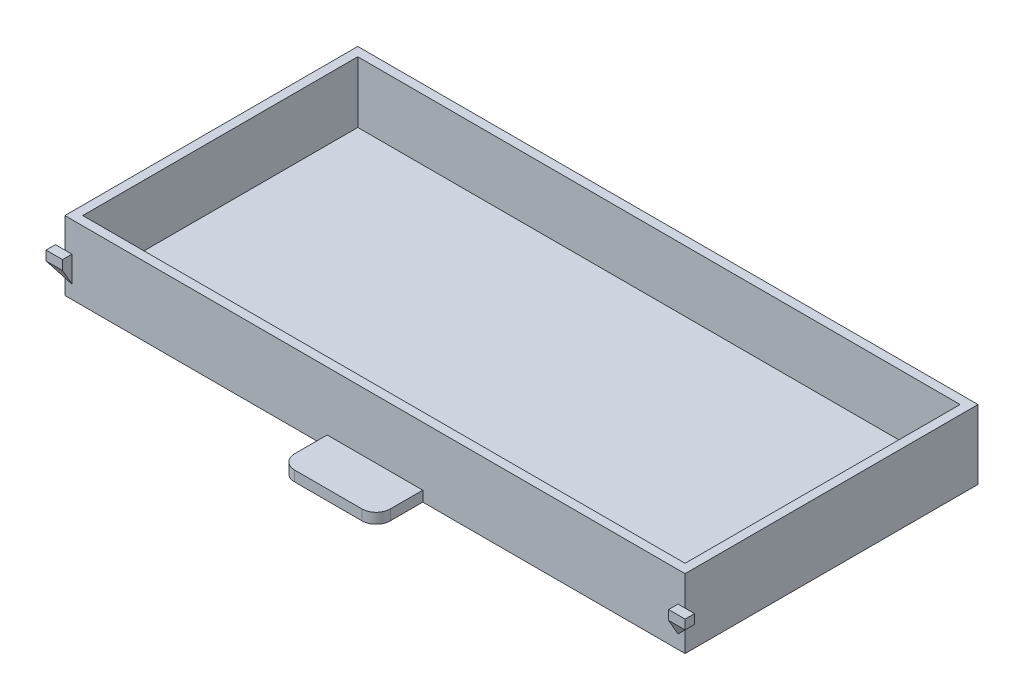
ISO-10303-21;
HEADER;
FILE_DESCRIPTION(('STEP AP214'),'2;1');
FILE_NAME('part.step','',(''),(''),'','','');
FILE_SCHEMA(('AUTOMOTIVE_DESIGN { 1 0 10303 214 1 1 1 1 }'));
ENDSEC;
DATA;
#1=APPLICATION_CONTEXT('core data for automotive mechanical design processes');
#2=APPLICATION_PROTOCOL_DEFINITION('international standard','automotive_design',2000,#1);
#3=PRODUCT_CONTEXT('',#1,'mechanical');
#4=PRODUCT('Part','Part','',(#3));
#5=PRODUCT_RELATED_PRODUCT_CATEGORY('part','',(#4));
#6=PRODUCT_DEFINITION_FORMATION('','',#4);
#7=PRODUCT_DEFINITION_CONTEXT('part definition',#1,'design');
#8=PRODUCT_DEFINITION('design','',#6,#7);
#9=PRODUCT_DEFINITION_SHAPE('','',#8);
#10=(LENGTH_UNIT() NAMED_UNIT(*) SI_UNIT(.MILLI.,.METRE.));
#11=(NAMED_UNIT(*) PLANE_ANGLE_UNIT() SI_UNIT($,.RADIAN.));
#12=(NAMED_UNIT(*) SI_UNIT($,.STERADIAN.) SOLID_ANGLE_UNIT());
#13=UNCERTAINTY_MEASURE_WITH_UNIT(LENGTH_MEASURE(1.E-05),#10,'distance_accuracy_value','');
#14=(GEOMETRIC_REPRESENTATION_CONTEXT(3) GLOBAL_UNCERTAINTY_ASSIGNED_CONTEXT((#13)) GLOBAL_UNIT_ASSIGNED_CONTEXT((#10,
#11,#12)) REPRESENTATION_CONTEXT('',''));
#15=CARTESIAN_POINT('',(0.,0.,0.));
#16=DIRECTION('',(0.,0.,1.));
#17=DIRECTION('',(1.,0.,0.));
#18=AXIS2_PLACEMENT_3D('',#15,#16,#17);
#19=CARTESIAN_POINT('',(-65.85,14.7,31.1));
#20=DIRECTION('',(0.,0.,-1.));
#21=DIRECTION('',(-1.,0.,0.));
#22=AXIS2_PLACEMENT_3D('',#19,#20,#21);
#23=PLANE('',#22);
#24=DIRECTION('',(0.707106781186548,0.707106781186547,0.));
#25=VECTOR('',#24,1.);
#26=CARTESIAN_POINT('',(30.7499999999999,-30.75,31.1));
#27=LINE('',#26,#25);
#28=CARTESIAN_POINT('',(64.35,2.85,31.1));
#29=VERTEX_POINT('',#28);
#30=CARTESIAN_POINT('',(65.85,4.35,31.1));
#31=VERTEX_POINT('',#30);
#32=EDGE_CURVE('E65',#29,#31,#27,.T.);
#33=ORIENTED_EDGE('',*,*,#32,.F.);
#34=DIRECTION('',(0.,-1.,0.));
#35=VECTOR('',#34,1.);
#36=CARTESIAN_POINT('',(64.35,0.,31.1));
#37=LINE('',#36,#35);
#38=CARTESIAN_POINT('',(64.35,8.35,31.1));
#39=VERTEX_POINT('',#38);
#40=EDGE_CURVE('E217',#39,#29,#37,.T.);
#41=ORIENTED_EDGE('',*,*,#40,.F.);
#42=DIRECTION('',(-1.,0.,0.));
#43=VECTOR('',#42,1.);
#44=CARTESIAN_POINT('',(0.,8.35,31.1));
#45=LINE('',#44,#43);
#46=CARTESIAN_POINT('',(65.85,8.35,31.1));
#47=VERTEX_POINT('',#46);
#48=EDGE_CURVE('E240',#47,#39,#45,.T.);
#49=ORIENTED_EDGE('',*,*,#48,.F.);
#50=DIRECTION('',(0.,-1.,0.));
#51=VECTOR('',#50,1.);
#52=CARTESIAN_POINT('',(65.85,14.7,31.1));
#53=LINE('',#52,#51);
#54=CARTESIAN_POINT('',(65.85,14.7,31.1));
#55=VERTEX_POINT('',#54);
#56=EDGE_CURVE('E412',#55,#47,#53,.T.);
#57=ORIENTED_EDGE('',*,*,#56,.F.);
#58=DIRECTION('',(1.,0.,0.));
#59=VECTOR('',#58,1.);
#60=CARTESIAN_POINT('',(-65.85,14.7,31.1));
#61=LINE('',#60,#59);
#62=CARTESIAN_POINT('',(-65.85,14.7,31.1));
#63=VERTEX_POINT('',#62);
#64=EDGE_CURVE('E380',#63,#55,#61,.T.);
#65=ORIENTED_EDGE('',*,*,#64,.F.);
#66=DIRECTION('',(0.,-1.,0.));
#67=VECTOR('',#66,1.);
#68=CARTESIAN_POINT('',(-65.85,14.7,31.1));
#69=LINE('',#68,#67);
#70=CARTESIAN_POINT('',(-65.85,8.35,31.1));
#71=VERTEX_POINT('',#70);
#72=EDGE_CURVE('E418',#63,#71,#69,.T.);
#73=ORIENTED_EDGE('',*,*,#72,.T.);
#74=DIRECTION('',(1.,0.,0.));
#75=VECTOR('',#74,1.);
#76=CARTESIAN_POINT('',(0.,8.35,31.1));
#77=LINE('',#76,#75);
#78=CARTESIAN_POINT('',(-64.35,8.35,31.1));
#79=VERTEX_POINT('',#78);
#80=EDGE_CURVE('E283',#71,#79,#77,.T.);
#81=ORIENTED_EDGE('',*,*,#80,.T.);
#82=DIRECTION('',(0.,-1.,0.));
#83=VECTOR('',#82,1.);
#84=CARTESIAN_POINT('',(-64.35,0.,31.1));
#85=LINE('',#84,#83);
#86=CARTESIAN_POINT('',(-64.35,2.85,31.1));
#87=VERTEX_POINT('',#86);
#88=EDGE_CURVE('E279',#79,#87,#85,.T.);
#89=ORIENTED_EDGE('',*,*,#88,.T.);
#90=DIRECTION('',(-0.707106781186548,0.707106781186547,0.));
#91=VECTOR('',#90,1.);
#92=CARTESIAN_POINT('',(-30.7499999999999,-30.75,31.1));
#93=LINE('',#92,#91);
#94=CARTESIAN_POINT('',(-65.85,4.35,31.1));
#95=VERTEX_POINT('',#94);
#96=EDGE_CURVE('E275',#87,#95,#93,.T.);
#97=ORIENTED_EDGE('',*,*,#96,.T.);
#98=CARTESIAN_POINT('',(-65.85,0.,31.1));
#99=VERTEX_POINT('',#98);
#100=EDGE_CURVE('E416',#95,#99,#69,.T.);
#101=ORIENTED_EDGE('',*,*,#100,.T.);
#102=DIRECTION('',(1.,0.,0.));
#103=VECTOR('',#102,1.);
#104=CARTESIAN_POINT('',(-65.85,0.,31.1));
#105=LINE('',#104,#103);
#106=CARTESIAN_POINT('',(-10.15,0.,31.1));
#107=VERTEX_POINT('',#106);
#108=EDGE_CURVE('E395',#99,#107,#105,.T.);
#109=ORIENTED_EDGE('',*,*,#108,.T.);
#110=DIRECTION('',(0.,-1.,0.));
#111=VECTOR('',#110,1.);
#112=CARTESIAN_POINT('',(-10.15,2.2,31.1));
#113=LINE('',#112,#111);
#114=CARTESIAN_POINT('',(-10.15,2.2,31.1));
#115=VERTEX_POINT('',#114);
#116=EDGE_CURVE('E314',#115,#107,#113,.T.);
#117=ORIENTED_EDGE('',*,*,#116,.F.);
#118=DIRECTION('',(1.,0.,0.));
#119=VECTOR('',#118,1.);
#120=CARTESIAN_POINT('',(-10.15,2.2,31.1));
#121=LINE('',#120,#119);
#122=CARTESIAN_POINT('',(10.15,2.2,31.1));
#123=VERTEX_POINT('',#122);
#124=EDGE_CURVE('E301',#115,#123,#121,.T.);
#125=ORIENTED_EDGE('',*,*,#124,.T.);
#126=DIRECTION('',(0.,-1.,0.));
#127=VECTOR('',#126,1.);
#128=CARTESIAN_POINT('',(10.15,2.2,31.1));
#129=LINE('',#128,#127);
#130=CARTESIAN_POINT('',(10.15,0.,31.1));
#131=VERTEX_POINT('',#130);
#132=EDGE_CURVE('E324',#123,#131,#129,.T.);
#133=ORIENTED_EDGE('',*,*,#132,.T.);
#134=CARTESIAN_POINT('',(65.85,0.,31.1));
#135=VERTEX_POINT('',#134);
#136=EDGE_CURVE('E394',#131,#135,#105,.T.);
#137=ORIENTED_EDGE('',*,*,#136,.T.);
#138=EDGE_CURVE('E411',#31,#135,#53,.T.);
#139=ORIENTED_EDGE('',*,*,#138,.F.);
#140=EDGE_LOOP('',(#33,#41,#49,#57,#65,#73,#81,#89,#97,#101,#109,#117,#125,#133,#137,#139));
#141=FACE_BOUND('',#140,.T.);
#142=ADVANCED_FACE('F41',(#141),#23,.F.);
#143=CARTESIAN_POINT('',(-65.85,14.7,-31.1));
#144=DIRECTION('',(1.,0.,0.));
#145=DIRECTION('',(0.,0.,-1.));
#146=AXIS2_PLACEMENT_3D('',#143,#144,#145);
#147=PLANE('',#146);
#148=DIRECTION('',(0.,0.,1.));
#149=VECTOR('',#148,1.);
#150=CARTESIAN_POINT('',(-65.85,0.,-31.1));
#151=LINE('',#150,#149);
#152=CARTESIAN_POINT('',(-65.85,0.,-31.1));
#153=VERTEX_POINT('',#152);
#154=EDGE_CURVE('E366',#153,#99,#151,.T.);
#155=ORIENTED_EDGE('',*,*,#154,.T.);
#156=ORIENTED_EDGE('',*,*,#100,.F.);
#157=EDGE_CURVE('E423',#71,#95,#69,.T.);
#158=ORIENTED_EDGE('',*,*,#157,.F.);
#159=ORIENTED_EDGE('',*,*,#72,.F.);
#160=DIRECTION('',(0.,0.,1.));
#161=VECTOR('',#160,1.);
#162=CARTESIAN_POINT('',(-65.85,14.7,-31.1));
#163=LINE('',#162,#161);
#164=CARTESIAN_POINT('',(-65.85,14.7,-31.1));
#165=VERTEX_POINT('',#164);
#166=EDGE_CURVE('E376',#165,#63,#163,.T.);
#167=ORIENTED_EDGE('',*,*,#166,.F.);
#168=DIRECTION('',(0.,-1.,0.));
#169=VECTOR('',#168,1.);
#170=CARTESIAN_POINT('',(-65.85,14.7,-31.1));
#171=LINE('',#170,#169);
#172=EDGE_CURVE('E390',#165,#153,#171,.T.);
#173=ORIENTED_EDGE('',*,*,#172,.T.);
#174=EDGE_LOOP('',(#155,#156,#158,#159,#167,#173));
#175=FACE_BOUND('',#174,.T.);
#176=ADVANCED_FACE('F487',(#175),#147,.F.);
#177=CARTESIAN_POINT('',(65.85,14.7,-31.1));
#178=DIRECTION('',(-1.,0.,0.));
#179=DIRECTION('',(0.,0.,1.));
#180=AXIS2_PLACEMENT_3D('',#177,#178,#179);
#181=PLANE('',#180);
#182=DIRECTION('',(0.,0.,-1.));
#183=VECTOR('',#182,1.);
#184=CARTESIAN_POINT('',(65.85,0.,-31.1));
#185=LINE('',#184,#183);
#186=CARTESIAN_POINT('',(65.85,0.,-31.1));
#187=VERTEX_POINT('',#186);
#188=EDGE_CURVE('E399',#135,#187,#185,.T.);
#189=ORIENTED_EDGE('',*,*,#188,.T.);
#190=DIRECTION('',(0.,-1.,0.));
#191=VECTOR('',#190,1.);
#192=CARTESIAN_POINT('',(65.85,14.7,-31.1));
#193=LINE('',#192,#191);
#194=CARTESIAN_POINT('',(65.85,14.7,-31.1));
#195=VERTEX_POINT('',#194);
#196=EDGE_CURVE('E407',#195,#187,#193,.T.);
#197=ORIENTED_EDGE('',*,*,#196,.F.);
#198=DIRECTION('',(0.,0.,-1.));
#199=VECTOR('',#198,1.);
#200=CARTESIAN_POINT('',(65.85,14.7,-31.1));
#201=LINE('',#200,#199);
#202=EDGE_CURVE('E384',#55,#195,#201,.T.);
#203=ORIENTED_EDGE('',*,*,#202,.F.);
#204=ORIENTED_EDGE('',*,*,#56,.T.);
#205=EDGE_CURVE('E417',#47,#31,#53,.T.);
#206=ORIENTED_EDGE('',*,*,#205,.T.);
#207=ORIENTED_EDGE('',*,*,#138,.T.);
#208=EDGE_LOOP('',(#189,#197,#203,#204,#206,#207));
#209=FACE_BOUND('',#208,.T.);
#210=ADVANCED_FACE('F501',(#209),#181,.F.);
#211=CARTESIAN_POINT('',(-65.85,14.7,-31.1));
#212=DIRECTION('',(0.,0.,1.));
#213=DIRECTION('',(1.,0.,0.));
#214=AXIS2_PLACEMENT_3D('',#211,#212,#213);
#215=PLANE('',#214);
#216=DIRECTION('',(-1.,0.,0.));
#217=VECTOR('',#216,1.);
#218=CARTESIAN_POINT('',(-65.85,0.,-31.1));
#219=LINE('',#218,#217);
#220=EDGE_CURVE('E381',#187,#153,#219,.T.);
#221=ORIENTED_EDGE('',*,*,#220,.T.);
#222=ORIENTED_EDGE('',*,*,#172,.F.);
#223=DIRECTION('',(-1.,0.,0.));
#224=VECTOR('',#223,1.);
#225=CARTESIAN_POINT('',(-65.85,14.7,-31.1));
#226=LINE('',#225,#224);
#227=EDGE_CURVE('E387',#195,#165,#226,.T.);
#228=ORIENTED_EDGE('',*,*,#227,.F.);
#229=ORIENTED_EDGE('',*,*,#196,.T.);
#230=EDGE_LOOP('',(#221,#222,#228,#229));
#231=FACE_BOUND('',#230,.T.);
#232=ADVANCED_FACE('F497',(#231),#215,.F.);
#233=CARTESIAN_POINT('',(0.,14.7,0.));
#234=DIRECTION('',(0.,1.,0.));
#235=DIRECTION('',(0.,0.,1.));
#236=AXIS2_PLACEMENT_3D('',#233,#234,#235);
#237=PLANE('',#236);
#238=DIRECTION('',(0.,0.,1.));
#239=VECTOR('',#238,1.);
#240=CARTESIAN_POINT('',(-63.95,14.7,-29.2));
#241=LINE('',#240,#239);
#242=CARTESIAN_POINT('',(-63.95,14.7,-29.2));
#243=VERTEX_POINT('',#242);
#244=CARTESIAN_POINT('',(-63.95,14.7,29.2));
#245=VERTEX_POINT('',#244);
#246=EDGE_CURVE('E328',#243,#245,#241,.T.);
#247=ORIENTED_EDGE('',*,*,#246,.F.);
#248=DIRECTION('',(-1.,0.,0.));
#249=VECTOR('',#248,1.);
#250=CARTESIAN_POINT('',(-63.95,14.7,-29.2));
#251=LINE('',#250,#249);
#252=CARTESIAN_POINT('',(63.95,14.7,-29.2));
#253=VERTEX_POINT('',#252);
#254=EDGE_CURVE('E337',#253,#243,#251,.T.);
#255=ORIENTED_EDGE('',*,*,#254,.F.);
#256=DIRECTION('',(0.,0.,-1.));
#257=VECTOR('',#256,1.);
#258=CARTESIAN_POINT('',(63.95,14.7,-29.2));
#259=LINE('',#258,#257);
#260=CARTESIAN_POINT('',(63.95,14.7,29.2));
#261=VERTEX_POINT('',#260);
#262=EDGE_CURVE('E356',#261,#253,#259,.T.);
#263=ORIENTED_EDGE('',*,*,#262,.F.);
#264=DIRECTION('',(1.,0.,0.));
#265=VECTOR('',#264,1.);
#266=CARTESIAN_POINT('',(-63.95,14.7,29.2));
#267=LINE('',#266,#265);
#268=EDGE_CURVE('E352',#245,#261,#267,.T.);
#269=ORIENTED_EDGE('',*,*,#268,.F.);
#270=EDGE_LOOP('',(#247,#255,#263,#269));
#271=FACE_BOUND('',#270,.T.);
#272=ORIENTED_EDGE('',*,*,#166,.T.);
#273=ORIENTED_EDGE('',*,*,#64,.T.);
#274=ORIENTED_EDGE('',*,*,#202,.T.);
#275=ORIENTED_EDGE('',*,*,#227,.T.);
#276=EDGE_LOOP('',(#272,#273,#274,#275));
#277=FACE_BOUND('',#276,.T.);
#278=ADVANCED_FACE('F591',(#271,#277),#237,.T.);
#279=CARTESIAN_POINT('',(0.,0.,0.));
#280=DIRECTION('',(0.,1.,0.));
#281=DIRECTION('',(0.,0.,1.));
#282=AXIS2_PLACEMENT_3D('',#279,#280,#281);
#283=PLANE('',#282);
#284=DIRECTION('',(-1.,0.,0.));
#285=VECTOR('',#284,1.);
#286=CARTESIAN_POINT('',(-10.15,0.,41.));
#287=LINE('',#286,#285);
#288=CARTESIAN_POINT('',(7.15,0.,41.));
#289=VERTEX_POINT('',#288);
#290=CARTESIAN_POINT('',(-7.15,0.,41.));
#291=VERTEX_POINT('',#290);
#292=EDGE_CURVE('E302',#289,#291,#287,.T.);
#293=ORIENTED_EDGE('',*,*,#292,.T.);
#294=CARTESIAN_POINT('',(-7.15,0.,38.));
#295=DIRECTION('',(0.,1.,0.));
#296=DIRECTION('',(0.,0.,1.));
#297=AXIS2_PLACEMENT_3D('',#294,#295,#296);
#298=CIRCLE('',#297,3.);
#299=CARTESIAN_POINT('',(-10.15,0.,38.));
#300=VERTEX_POINT('',#299);
#301=EDGE_CURVE('E433',#291,#300,#298,.F.);
#302=ORIENTED_EDGE('',*,*,#301,.T.);
#303=DIRECTION('',(0.,0.,-1.));
#304=VECTOR('',#303,1.);
#305=CARTESIAN_POINT('',(-10.15,0.,31.1));
#306=LINE('',#305,#304);
#307=EDGE_CURVE('E297',#300,#107,#306,.T.);
#308=ORIENTED_EDGE('',*,*,#307,.T.);
#309=ORIENTED_EDGE('',*,*,#108,.F.);
#310=ORIENTED_EDGE('',*,*,#154,.F.);
#311=ORIENTED_EDGE('',*,*,#220,.F.);
#312=ORIENTED_EDGE('',*,*,#188,.F.);
#313=ORIENTED_EDGE('',*,*,#136,.F.);
#314=DIRECTION('',(0.,0.,1.));
#315=VECTOR('',#314,1.);
#316=CARTESIAN_POINT('',(10.15,0.,31.1));
#317=LINE('',#316,#315);
#318=CARTESIAN_POINT('',(10.15,0.,38.));
#319=VERTEX_POINT('',#318);
#320=EDGE_CURVE('E317',#131,#319,#317,.T.);
#321=ORIENTED_EDGE('',*,*,#320,.T.);
#322=CARTESIAN_POINT('',(7.15,0.,38.));
#323=DIRECTION('',(0.,1.,0.));
#324=DIRECTION('',(0.,0.,1.));
#325=AXIS2_PLACEMENT_3D('',#322,#323,#324);
#326=CIRCLE('',#325,3.);
#327=EDGE_CURVE('E430',#319,#289,#326,.F.);
#328=ORIENTED_EDGE('',*,*,#327,.T.);
#329=EDGE_LOOP('',(#293,#302,#308,#309,#310,#311,#312,#313,#321,#328));
#330=FACE_BOUND('',#329,.T.);
#331=ADVANCED_FACE('F454',(#330),#283,.F.);
#332=CARTESIAN_POINT('',(-63.95,1.7,-29.2));
#333=DIRECTION('',(-1.,0.,0.));
#334=DIRECTION('',(0.,0.,1.));
#335=AXIS2_PLACEMENT_3D('',#332,#333,#334);
#336=PLANE('',#335);
#337=ORIENTED_EDGE('',*,*,#246,.T.);
#338=DIRECTION('',(0.,1.,0.));
#339=VECTOR('',#338,1.);
#340=CARTESIAN_POINT('',(-63.95,1.7,29.2));
#341=LINE('',#340,#339);
#342=CARTESIAN_POINT('',(-63.95,1.7,29.2));
#343=VERTEX_POINT('',#342);
#344=EDGE_CURVE('E349',#343,#245,#341,.T.);
#345=ORIENTED_EDGE('',*,*,#344,.F.);
#346=DIRECTION('',(0.,0.,1.));
#347=VECTOR('',#346,1.);
#348=CARTESIAN_POINT('',(-63.95,1.7,-29.2));
#349=LINE('',#348,#347);
#350=CARTESIAN_POINT('',(-63.95,1.7,-29.2));
#351=VERTEX_POINT('',#350);
#352=EDGE_CURVE('E332',#351,#343,#349,.T.);
#353=ORIENTED_EDGE('',*,*,#352,.F.);
#354=DIRECTION('',(0.,1.,0.));
#355=VECTOR('',#354,1.);
#356=CARTESIAN_POINT('',(-63.95,1.7,-29.2));
#357=LINE('',#356,#355);
#358=EDGE_CURVE('E363',#351,#243,#357,.T.);
#359=ORIENTED_EDGE('',*,*,#358,.T.);
#360=EDGE_LOOP('',(#337,#345,#353,#359));
#361=FACE_BOUND('',#360,.T.);
#362=ADVANCED_FACE('F580',(#361),#336,.F.);
#363=CARTESIAN_POINT('',(-63.95,1.7,-29.2));
#364=DIRECTION('',(0.,0.,-1.));
#365=DIRECTION('',(-1.,0.,0.));
#366=AXIS2_PLACEMENT_3D('',#363,#364,#365);
#367=PLANE('',#366);
#368=ORIENTED_EDGE('',*,*,#254,.T.);
#369=ORIENTED_EDGE('',*,*,#358,.F.);
#370=DIRECTION('',(-1.,0.,0.));
#371=VECTOR('',#370,1.);
#372=CARTESIAN_POINT('',(-63.95,1.7,-29.2));
#373=LINE('',#372,#371);
#374=CARTESIAN_POINT('',(63.95,1.7,-29.2));
#375=VERTEX_POINT('',#374);
#376=EDGE_CURVE('E345',#375,#351,#373,.T.);
#377=ORIENTED_EDGE('',*,*,#376,.F.);
#378=DIRECTION('',(0.,1.,0.));
#379=VECTOR('',#378,1.);
#380=CARTESIAN_POINT('',(63.95,1.7,-29.2));
#381=LINE('',#380,#379);
#382=EDGE_CURVE('E367',#375,#253,#381,.T.);
#383=ORIENTED_EDGE('',*,*,#382,.T.);
#384=EDGE_LOOP('',(#368,#369,#377,#383));
#385=FACE_BOUND('',#384,.T.);
#386=ADVANCED_FACE('F576',(#385),#367,.F.);
#387=CARTESIAN_POINT('',(63.95,1.7,-29.2));
#388=DIRECTION('',(1.,0.,0.));
#389=DIRECTION('',(0.,0.,-1.));
#390=AXIS2_PLACEMENT_3D('',#387,#388,#389);
#391=PLANE('',#390);
#392=ORIENTED_EDGE('',*,*,#262,.T.);
#393=ORIENTED_EDGE('',*,*,#382,.F.);
#394=DIRECTION('',(0.,0.,-1.));
#395=VECTOR('',#394,1.);
#396=CARTESIAN_POINT('',(63.95,1.7,-29.2));
#397=LINE('',#396,#395);
#398=CARTESIAN_POINT('',(63.95,1.7,29.2));
#399=VERTEX_POINT('',#398);
#400=EDGE_CURVE('E341',#399,#375,#397,.T.);
#401=ORIENTED_EDGE('',*,*,#400,.F.);
#402=DIRECTION('',(0.,1.,0.));
#403=VECTOR('',#402,1.);
#404=CARTESIAN_POINT('',(63.95,1.7,29.2));
#405=LINE('',#404,#403);
#406=EDGE_CURVE('E370',#399,#261,#405,.T.);
#407=ORIENTED_EDGE('',*,*,#406,.T.);
#408=EDGE_LOOP('',(#392,#393,#401,#407));
#409=FACE_BOUND('',#408,.T.);
#410=ADVANCED_FACE('F579',(#409),#391,.F.);
#411=CARTESIAN_POINT('',(-63.95,1.7,29.2));
#412=DIRECTION('',(0.,0.,1.));
#413=DIRECTION('',(1.,0.,0.));
#414=AXIS2_PLACEMENT_3D('',#411,#412,#413);
#415=PLANE('',#414);
#416=ORIENTED_EDGE('',*,*,#268,.T.);
#417=ORIENTED_EDGE('',*,*,#406,.F.);
#418=DIRECTION('',(1.,0.,0.));
#419=VECTOR('',#418,1.);
#420=CARTESIAN_POINT('',(-63.95,1.7,29.2));
#421=LINE('',#420,#419);
#422=EDGE_CURVE('E336',#343,#399,#421,.T.);
#423=ORIENTED_EDGE('',*,*,#422,.F.);
#424=ORIENTED_EDGE('',*,*,#344,.T.);
#425=EDGE_LOOP('',(#416,#417,#423,#424));
#426=FACE_BOUND('',#425,.T.);
#427=ADVANCED_FACE('F571',(#426),#415,.F.);
#428=CARTESIAN_POINT('',(0.,1.7,0.));
#429=DIRECTION('',(0.,1.,0.));
#430=DIRECTION('',(0.,0.,1.));
#431=AXIS2_PLACEMENT_3D('',#428,#429,#430);
#432=PLANE('',#431);
#433=ORIENTED_EDGE('',*,*,#352,.T.);
#434=ORIENTED_EDGE('',*,*,#422,.T.);
#435=ORIENTED_EDGE('',*,*,#400,.T.);
#436=ORIENTED_EDGE('',*,*,#376,.T.);
#437=EDGE_LOOP('',(#433,#434,#435,#436));
#438=FACE_BOUND('',#437,.T.);
#439=ADVANCED_FACE('F564',(#438),#432,.T.);
#440=CARTESIAN_POINT('',(-10.15,2.2,31.1));
#441=DIRECTION('',(-1.,0.,0.));
#442=DIRECTION('',(0.,0.,1.));
#443=AXIS2_PLACEMENT_3D('',#440,#441,#442);
#444=PLANE('',#443);
#445=ORIENTED_EDGE('',*,*,#307,.F.);
#446=DIRECTION('',(0.,-1.,0.));
#447=VECTOR('',#446,1.);
#448=CARTESIAN_POINT('',(-10.15,2.2,38.));
#449=LINE('',#448,#447);
#450=CARTESIAN_POINT('',(-10.15,2.2,38.));
#451=VERTEX_POINT('',#450);
#452=EDGE_CURVE('E436',#300,#451,#449,.F.);
#453=ORIENTED_EDGE('',*,*,#452,.T.);
#454=DIRECTION('',(0.,0.,-1.));
#455=VECTOR('',#454,1.);
#456=CARTESIAN_POINT('',(-10.15,2.2,31.1));
#457=LINE('',#456,#455);
#458=EDGE_CURVE('E298',#451,#115,#457,.T.);
#459=ORIENTED_EDGE('',*,*,#458,.T.);
#460=ORIENTED_EDGE('',*,*,#116,.T.);
#461=EDGE_LOOP('',(#445,#453,#459,#460));
#462=FACE_BOUND('',#461,.T.);
#463=ADVANCED_FACE('F562',(#462),#444,.T.);
#464=CARTESIAN_POINT('',(-10.15,2.2,41.));
#465=DIRECTION('',(0.,0.,1.));
#466=DIRECTION('',(1.,0.,0.));
#467=AXIS2_PLACEMENT_3D('',#464,#465,#466);
#468=PLANE('',#467);
#469=DIRECTION('',(-1.,0.,0.));
#470=VECTOR('',#469,1.);
#471=CARTESIAN_POINT('',(-10.15,2.2,41.));
#472=LINE('',#471,#470);
#473=CARTESIAN_POINT('',(7.15,2.2,41.));
#474=VERTEX_POINT('',#473);
#475=CARTESIAN_POINT('',(-7.15,2.2,41.));
#476=VERTEX_POINT('',#475);
#477=EDGE_CURVE('E310',#474,#476,#472,.T.);
#478=ORIENTED_EDGE('',*,*,#477,.T.);
#479=DIRECTION('',(0.,-1.,0.));
#480=VECTOR('',#479,1.);
#481=CARTESIAN_POINT('',(-7.15,2.2,41.));
#482=LINE('',#481,#480);
#483=EDGE_CURVE('E426',#476,#291,#482,.T.);
#484=ORIENTED_EDGE('',*,*,#483,.T.);
#485=ORIENTED_EDGE('',*,*,#292,.F.);
#486=DIRECTION('',(0.,-1.,0.));
#487=VECTOR('',#486,1.);
#488=CARTESIAN_POINT('',(7.15,2.2,41.));
#489=LINE('',#488,#487);
#490=EDGE_CURVE('E422',#289,#474,#489,.F.);
#491=ORIENTED_EDGE('',*,*,#490,.T.);
#492=EDGE_LOOP('',(#478,#484,#485,#491));
#493=FACE_BOUND('',#492,.T.);
#494=ADVANCED_FACE('F559',(#493),#468,.T.);
#495=CARTESIAN_POINT('',(10.15,2.2,31.1));
#496=DIRECTION('',(1.,0.,0.));
#497=DIRECTION('',(0.,0.,-1.));
#498=AXIS2_PLACEMENT_3D('',#495,#496,#497);
#499=PLANE('',#498);
#500=DIRECTION('',(0.,0.,1.));
#501=VECTOR('',#500,1.);
#502=CARTESIAN_POINT('',(10.15,2.2,31.1));
#503=LINE('',#502,#501);
#504=CARTESIAN_POINT('',(10.15,2.2,38.));
#505=VERTEX_POINT('',#504);
#506=EDGE_CURVE('E306',#123,#505,#503,.T.);
#507=ORIENTED_EDGE('',*,*,#506,.T.);
#508=DIRECTION('',(0.,-1.,0.));
#509=VECTOR('',#508,1.);
#510=CARTESIAN_POINT('',(10.15,2.2,38.));
#511=LINE('',#510,#509);
#512=EDGE_CURVE('E50',#505,#319,#511,.T.);
#513=ORIENTED_EDGE('',*,*,#512,.T.);
#514=ORIENTED_EDGE('',*,*,#320,.F.);
#515=ORIENTED_EDGE('',*,*,#132,.F.);
#516=EDGE_LOOP('',(#507,#513,#514,#515));
#517=FACE_BOUND('',#516,.T.);
#518=ADVANCED_FACE('F448',(#517),#499,.T.);
#519=CARTESIAN_POINT('',(0.,2.2,0.));
#520=DIRECTION('',(0.,1.,0.));
#521=DIRECTION('',(0.,0.,1.));
#522=AXIS2_PLACEMENT_3D('',#519,#520,#521);
#523=PLANE('',#522);
#524=ORIENTED_EDGE('',*,*,#458,.F.);
#525=CARTESIAN_POINT('',(-7.15,2.2,38.));
#526=DIRECTION('',(0.,1.,0.));
#527=DIRECTION('',(0.,0.,1.));
#528=AXIS2_PLACEMENT_3D('',#525,#526,#527);
#529=CIRCLE('',#528,3.);
#530=EDGE_CURVE('E442',#451,#476,#529,.T.);
#531=ORIENTED_EDGE('',*,*,#530,.T.);
#532=ORIENTED_EDGE('',*,*,#477,.F.);
#533=CARTESIAN_POINT('',(7.15,2.2,38.));
#534=DIRECTION('',(0.,1.,0.));
#535=DIRECTION('',(0.,0.,1.));
#536=AXIS2_PLACEMENT_3D('',#533,#534,#535);
#537=CIRCLE('',#536,3.);
#538=EDGE_CURVE('E439',#474,#505,#537,.T.);
#539=ORIENTED_EDGE('',*,*,#538,.T.);
#540=ORIENTED_EDGE('',*,*,#506,.F.);
#541=ORIENTED_EDGE('',*,*,#124,.F.);
#542=EDGE_LOOP('',(#524,#531,#532,#539,#540,#541));
#543=FACE_BOUND('',#542,.T.);
#544=ADVANCED_FACE('F544',(#543),#523,.T.);
#545=CARTESIAN_POINT('',(-7.15,2.2,38.));
#546=DIRECTION('',(0.,-1.,0.));
#547=DIRECTION('',(0.,0.,-1.));
#548=AXIS2_PLACEMENT_3D('',#545,#546,#547);
#549=CYLINDRICAL_SURFACE('',#548,3.);
#550=ORIENTED_EDGE('',*,*,#530,.F.);
#551=ORIENTED_EDGE('',*,*,#452,.F.);
#552=ORIENTED_EDGE('',*,*,#301,.F.);
#553=ORIENTED_EDGE('',*,*,#483,.F.);
#554=EDGE_LOOP('',(#550,#551,#552,#553));
#555=FACE_BOUND('',#554,.T.);
#556=ADVANCED_FACE('F542',(#555),#549,.T.);
#557=CARTESIAN_POINT('',(7.15,2.2,38.));
#558=DIRECTION('',(0.,-1.,0.));
#559=DIRECTION('',(0.,0.,-1.));
#560=AXIS2_PLACEMENT_3D('',#557,#558,#559);
#561=CYLINDRICAL_SURFACE('',#560,3.);
#562=ORIENTED_EDGE('',*,*,#538,.F.);
#563=ORIENTED_EDGE('',*,*,#490,.F.);
#564=ORIENTED_EDGE('',*,*,#327,.F.);
#565=ORIENTED_EDGE('',*,*,#512,.F.);
#566=EDGE_LOOP('',(#562,#563,#564,#565));
#567=FACE_BOUND('',#566,.T.);
#568=ADVANCED_FACE('F43',(#567),#561,.T.);
#569=CARTESIAN_POINT('',(0.,0.,31.1));
#570=DIRECTION('',(0.,0.,1.));
#571=DIRECTION('',(1.,0.,0.));
#572=AXIS2_PLACEMENT_3D('',#569,#570,#571);
#573=PLANE('',#572);
#574=CARTESIAN_POINT('',(-67.85,8.35,31.1));
#575=VERTEX_POINT('',#574);
#576=EDGE_CURVE('E262',#575,#71,#77,.T.);
#577=ORIENTED_EDGE('',*,*,#576,.T.);
#578=ORIENTED_EDGE('',*,*,#157,.T.);
#579=CARTESIAN_POINT('',(-67.85,6.35,31.1));
#580=VERTEX_POINT('',#579);
#581=EDGE_CURVE('E274',#95,#580,#93,.T.);
#582=ORIENTED_EDGE('',*,*,#581,.T.);
#583=DIRECTION('',(0.,-1.,0.));
#584=VECTOR('',#583,1.);
#585=CARTESIAN_POINT('',(-67.85,0.,31.1));
#586=LINE('',#585,#584);
#587=EDGE_CURVE('E256',#575,#580,#586,.T.);
#588=ORIENTED_EDGE('',*,*,#587,.F.);
#589=EDGE_LOOP('',(#577,#578,#582,#588));
#590=FACE_BOUND('',#589,.T.);
#591=ADVANCED_FACE('F468',(#590),#573,.F.);
#592=CARTESIAN_POINT('',(-67.85,0.,33.1));
#593=DIRECTION('',(1.,0.,0.));
#594=DIRECTION('',(0.,0.,-1.));
#595=AXIS2_PLACEMENT_3D('',#592,#593,#594);
#596=PLANE('',#595);
#597=ORIENTED_EDGE('',*,*,#587,.T.);
#598=DIRECTION('',(0.,0.,-1.));
#599=VECTOR('',#598,1.);
#600=CARTESIAN_POINT('',(-67.85,6.35,33.1));
#601=LINE('',#600,#599);
#602=CARTESIAN_POINT('',(-67.85,6.35,33.1));
#603=VERTEX_POINT('',#602);
#604=EDGE_CURVE('E293',#603,#580,#601,.T.);
#605=ORIENTED_EDGE('',*,*,#604,.F.);
#606=DIRECTION('',(0.,-1.,0.));
#607=VECTOR('',#606,1.);
#608=CARTESIAN_POINT('',(-67.85,0.,33.1));
#609=LINE('',#608,#607);
#610=CARTESIAN_POINT('',(-67.85,8.35,33.1));
#611=VERTEX_POINT('',#610);
#612=EDGE_CURVE('E257',#611,#603,#609,.T.);
#613=ORIENTED_EDGE('',*,*,#612,.F.);
#614=DIRECTION('',(0.,0.,-1.));
#615=VECTOR('',#614,1.);
#616=CARTESIAN_POINT('',(-67.85,8.35,33.1));
#617=LINE('',#616,#615);
#618=EDGE_CURVE('E270',#611,#575,#617,.T.);
#619=ORIENTED_EDGE('',*,*,#618,.T.);
#620=EDGE_LOOP('',(#597,#605,#613,#619));
#621=FACE_BOUND('',#620,.T.);
#622=ADVANCED_FACE('F477',(#621),#596,.F.);
#623=CARTESIAN_POINT('',(-30.7499999999999,-30.75,33.1));
#624=DIRECTION('',(-0.707106781186547,-0.707106781186548,0.));
#625=DIRECTION('',(0.707106781186548,-0.707106781186547,0.));
#626=AXIS2_PLACEMENT_3D('',#623,#624,#625);
#627=PLANE('',#626);
#628=DIRECTION('',(0.655610068107187,-0.655610068107185,-0.374634324632677));
#629=VECTOR('',#628,1.);
#630=CARTESIAN_POINT('',(-35.9570175438596,-25.5429824561403,14.8754385964912));
#631=LINE('',#630,#629);
#632=EDGE_CURVE('E241',#603,#87,#631,.T.);
#633=ORIENTED_EDGE('',*,*,#632,.F.);
#634=ORIENTED_EDGE('',*,*,#604,.T.);
#635=ORIENTED_EDGE('',*,*,#581,.F.);
#636=ORIENTED_EDGE('',*,*,#96,.F.);
#637=EDGE_LOOP('',(#633,#634,#635,#636));
#638=FACE_BOUND('',#637,.T.);
#639=ADVANCED_FACE('F474',(#638),#627,.T.);
#640=CARTESIAN_POINT('',(-64.35,0.,33.1));
#641=DIRECTION('',(1.,0.,0.));
#642=DIRECTION('',(0.,0.,-1.));
#643=AXIS2_PLACEMENT_3D('',#640,#641,#642);
#644=PLANE('',#643);
#645=DIRECTION('',(0.,0.868243142124459,0.496138938356834));
#646=VECTOR('',#645,1.);
#647=CARTESIAN_POINT('',(-64.35,1.56307692307693,30.3646153846154));
#648=LINE('',#647,#646);
#649=CARTESIAN_POINT('',(-64.35,6.35,33.1));
#650=VERTEX_POINT('',#649);
#651=EDGE_CURVE('E57',#87,#650,#648,.T.);
#652=ORIENTED_EDGE('',*,*,#651,.F.);
#653=ORIENTED_EDGE('',*,*,#88,.F.);
#654=DIRECTION('',(0.,0.,-1.));
#655=VECTOR('',#654,1.);
#656=CARTESIAN_POINT('',(-64.35,8.35,33.1));
#657=LINE('',#656,#655);
#658=CARTESIAN_POINT('',(-64.35,8.35,33.1));
#659=VERTEX_POINT('',#658);
#660=EDGE_CURVE('E289',#659,#79,#657,.T.);
#661=ORIENTED_EDGE('',*,*,#660,.F.);
#662=DIRECTION('',(0.,-1.,0.));
#663=VECTOR('',#662,1.);
#664=CARTESIAN_POINT('',(-64.35,0.,33.1));
#665=LINE('',#664,#663);
#666=EDGE_CURVE('E261',#659,#650,#665,.T.);
#667=ORIENTED_EDGE('',*,*,#666,.T.);
#668=EDGE_LOOP('',(#652,#653,#661,#667));
#669=FACE_BOUND('',#668,.T.);
#670=ADVANCED_FACE('F622',(#669),#644,.T.);
#671=CARTESIAN_POINT('',(0.,8.35,33.1));
#672=DIRECTION('',(0.,1.,0.));
#673=DIRECTION('',(0.,0.,1.));
#674=AXIS2_PLACEMENT_3D('',#671,#672,#673);
#675=PLANE('',#674);
#676=ORIENTED_EDGE('',*,*,#576,.F.);
#677=ORIENTED_EDGE('',*,*,#618,.F.);
#678=DIRECTION('',(1.,0.,0.));
#679=VECTOR('',#678,1.);
#680=CARTESIAN_POINT('',(0.,8.35,33.1));
#681=LINE('',#680,#679);
#682=EDGE_CURVE('E266',#611,#659,#681,.T.);
#683=ORIENTED_EDGE('',*,*,#682,.T.);
#684=ORIENTED_EDGE('',*,*,#660,.T.);
#685=ORIENTED_EDGE('',*,*,#80,.F.);
#686=EDGE_LOOP('',(#676,#677,#683,#684,#685));
#687=FACE_BOUND('',#686,.T.);
#688=ADVANCED_FACE('F480',(#687),#675,.T.);
#689=CARTESIAN_POINT('',(0.,0.,33.1));
#690=DIRECTION('',(0.,0.,1.));
#691=DIRECTION('',(1.,0.,0.));
#692=AXIS2_PLACEMENT_3D('',#689,#690,#691);
#693=PLANE('',#692);
#694=DIRECTION('',(-1.,0.,0.));
#695=VECTOR('',#694,1.);
#696=CARTESIAN_POINT('',(134.15,6.35,33.1));
#697=LINE('',#696,#695);
#698=EDGE_CURVE('E514',#650,#603,#697,.T.);
#699=ORIENTED_EDGE('',*,*,#698,.F.);
#700=ORIENTED_EDGE('',*,*,#666,.F.);
#701=ORIENTED_EDGE('',*,*,#682,.F.);
#702=ORIENTED_EDGE('',*,*,#612,.T.);
#703=EDGE_LOOP('',(#699,#700,#701,#702));
#704=FACE_BOUND('',#703,.T.);
#705=ADVANCED_FACE('F639',(#704),#693,.T.);
#706=CARTESIAN_POINT('',(0.,0.,31.1));
#707=DIRECTION('',(0.,0.,1.));
#708=DIRECTION('',(-1.,0.,0.));
#709=AXIS2_PLACEMENT_3D('',#706,#707,#708);
#710=PLANE('',#709);
#711=CARTESIAN_POINT('',(67.85,6.35,31.1));
#712=VERTEX_POINT('',#711);
#713=EDGE_CURVE('E248',#31,#712,#27,.T.);
#714=ORIENTED_EDGE('',*,*,#713,.F.);
#715=ORIENTED_EDGE('',*,*,#205,.F.);
#716=CARTESIAN_POINT('',(67.85,8.35,31.1));
#717=VERTEX_POINT('',#716);
#718=EDGE_CURVE('E242',#717,#47,#45,.T.);
#719=ORIENTED_EDGE('',*,*,#718,.F.);
#720=DIRECTION('',(0.,-1.,0.));
#721=VECTOR('',#720,1.);
#722=CARTESIAN_POINT('',(67.85,0.,31.1));
#723=LINE('',#722,#721);
#724=EDGE_CURVE('E236',#717,#712,#723,.T.);
#725=ORIENTED_EDGE('',*,*,#724,.T.);
#726=EDGE_LOOP('',(#714,#715,#719,#725));
#727=FACE_BOUND('',#726,.T.);
#728=ADVANCED_FACE('F532',(#727),#710,.F.);
#729=CARTESIAN_POINT('',(67.85,0.,33.1));
#730=DIRECTION('',(1.,0.,0.));
#731=DIRECTION('',(0.,0.,-1.));
#732=AXIS2_PLACEMENT_3D('',#729,#730,#731);
#733=PLANE('',#732);
#734=ORIENTED_EDGE('',*,*,#724,.F.);
#735=DIRECTION('',(0.,0.,-1.));
#736=VECTOR('',#735,1.);
#737=CARTESIAN_POINT('',(67.85,8.35,33.1));
#738=LINE('',#737,#736);
#739=CARTESIAN_POINT('',(67.85,8.35,33.1));
#740=VERTEX_POINT('',#739);
#741=EDGE_CURVE('E253',#740,#717,#738,.T.);
#742=ORIENTED_EDGE('',*,*,#741,.F.);
#743=DIRECTION('',(0.,-1.,0.));
#744=VECTOR('',#743,1.);
#745=CARTESIAN_POINT('',(67.85,0.,33.1));
#746=LINE('',#745,#744);
#747=CARTESIAN_POINT('',(67.85,6.35,33.1));
#748=VERTEX_POINT('',#747);
#749=EDGE_CURVE('E232',#740,#748,#746,.T.);
#750=ORIENTED_EDGE('',*,*,#749,.T.);
#751=DIRECTION('',(0.,0.,-1.));
#752=VECTOR('',#751,1.);
#753=CARTESIAN_POINT('',(67.85,6.35,33.1));
#754=LINE('',#753,#752);
#755=EDGE_CURVE('E225',#748,#712,#754,.T.);
#756=ORIENTED_EDGE('',*,*,#755,.T.);
#757=EDGE_LOOP('',(#734,#742,#750,#756));
#758=FACE_BOUND('',#757,.T.);
#759=ADVANCED_FACE('F521',(#758),#733,.T.);
#760=CARTESIAN_POINT('',(0.,8.35,33.1));
#761=DIRECTION('',(0.,-1.,0.));
#762=DIRECTION('',(0.,0.,-1.));
#763=AXIS2_PLACEMENT_3D('',#760,#761,#762);
#764=PLANE('',#763);
#765=ORIENTED_EDGE('',*,*,#718,.T.);
#766=ORIENTED_EDGE('',*,*,#48,.T.);
#767=DIRECTION('',(0.,0.,-1.));
#768=VECTOR('',#767,1.);
#769=CARTESIAN_POINT('',(64.35,8.35,33.1));
#770=LINE('',#769,#768);
#771=CARTESIAN_POINT('',(64.35,8.35,33.1));
#772=VERTEX_POINT('',#771);
#773=EDGE_CURVE('E230',#772,#39,#770,.T.);
#774=ORIENTED_EDGE('',*,*,#773,.F.);
#775=DIRECTION('',(-1.,0.,0.));
#776=VECTOR('',#775,1.);
#777=CARTESIAN_POINT('',(0.,8.35,33.1));
#778=LINE('',#777,#776);
#779=EDGE_CURVE('E222',#740,#772,#778,.T.);
#780=ORIENTED_EDGE('',*,*,#779,.F.);
#781=ORIENTED_EDGE('',*,*,#741,.T.);
#782=EDGE_LOOP('',(#765,#766,#774,#780,#781));
#783=FACE_BOUND('',#782,.T.);
#784=ADVANCED_FACE('F523',(#783),#764,.F.);
#785=CARTESIAN_POINT('',(64.35,0.,33.1));
#786=DIRECTION('',(1.,0.,0.));
#787=DIRECTION('',(0.,0.,-1.));
#788=AXIS2_PLACEMENT_3D('',#785,#786,#787);
#789=PLANE('',#788);
#790=ORIENTED_EDGE('',*,*,#40,.T.);
#791=DIRECTION('',(0.,0.868243142124459,0.496138938356834));
#792=VECTOR('',#791,1.);
#793=CARTESIAN_POINT('',(64.35,1.56307692307693,30.3646153846154));
#794=LINE('',#793,#792);
#795=CARTESIAN_POINT('',(64.35,6.35,33.1));
#796=VERTEX_POINT('',#795);
#797=EDGE_CURVE('E204',#29,#796,#794,.T.);
#798=ORIENTED_EDGE('',*,*,#797,.T.);
#799=DIRECTION('',(0.,-1.,0.));
#800=VECTOR('',#799,1.);
#801=CARTESIAN_POINT('',(64.35,0.,33.1));
#802=LINE('',#801,#800);
#803=EDGE_CURVE('E215',#772,#796,#802,.T.);
#804=ORIENTED_EDGE('',*,*,#803,.F.);
#805=ORIENTED_EDGE('',*,*,#773,.T.);
#806=EDGE_LOOP('',(#790,#798,#804,#805));
#807=FACE_BOUND('',#806,.T.);
#808=ADVANCED_FACE('F213',(#807),#789,.F.);
#809=CARTESIAN_POINT('',(30.7499999999999,-30.75,33.1));
#810=DIRECTION('',(-0.707106781186547,0.707106781186548,0.));
#811=DIRECTION('',(-0.707106781186548,-0.707106781186547,0.));
#812=AXIS2_PLACEMENT_3D('',#809,#810,#811);
#813=PLANE('',#812);
#814=ORIENTED_EDGE('',*,*,#755,.F.);
#815=DIRECTION('',(-0.655610068107187,-0.655610068107185,-0.374634324632677));
#816=VECTOR('',#815,1.);
#817=CARTESIAN_POINT('',(35.9570175438596,-25.5429824561403,14.8754385964912));
#818=LINE('',#817,#816);
#819=EDGE_CURVE('E205',#748,#29,#818,.T.);
#820=ORIENTED_EDGE('',*,*,#819,.T.);
#821=ORIENTED_EDGE('',*,*,#32,.T.);
#822=ORIENTED_EDGE('',*,*,#713,.T.);
#823=EDGE_LOOP('',(#814,#820,#821,#822));
#824=FACE_BOUND('',#823,.T.);
#825=ADVANCED_FACE('F530',(#824),#813,.F.);
#826=CARTESIAN_POINT('',(0.,0.,33.1));
#827=DIRECTION('',(0.,0.,1.));
#828=DIRECTION('',(-1.,0.,0.));
#829=AXIS2_PLACEMENT_3D('',#826,#827,#828);
#830=PLANE('',#829);
#831=DIRECTION('',(-1.,0.,0.));
#832=VECTOR('',#831,1.);
#833=CARTESIAN_POINT('',(0.,6.35,33.1));
#834=LINE('',#833,#832);
#835=EDGE_CURVE('E11',#748,#796,#834,.T.);
#836=ORIENTED_EDGE('',*,*,#835,.F.);
#837=ORIENTED_EDGE('',*,*,#749,.F.);
#838=ORIENTED_EDGE('',*,*,#779,.T.);
#839=ORIENTED_EDGE('',*,*,#803,.T.);
#840=EDGE_LOOP('',(#836,#837,#838,#839));
#841=FACE_BOUND('',#840,.T.);
#842=ADVANCED_FACE('F220',(#841),#830,.T.);
#843=CARTESIAN_POINT('',(134.15,6.35,33.1));
#844=DIRECTION('',(0.,0.496138938356834,-0.868243142124459));
#845=DIRECTION('',(0.,0.868243142124459,0.496138938356834));
#846=AXIS2_PLACEMENT_3D('',#843,#844,#845);
#847=PLANE('',#846);
#848=ORIENTED_EDGE('',*,*,#819,.F.);
#849=ORIENTED_EDGE('',*,*,#835,.T.);
#850=ORIENTED_EDGE('',*,*,#797,.F.);
#851=EDGE_LOOP('',(#848,#849,#850));
#852=FACE_BOUND('',#851,.T.);
#853=ADVANCED_FACE('F203',(#852),#847,.F.);
#854=ORIENTED_EDGE('',*,*,#632,.T.);
#855=ORIENTED_EDGE('',*,*,#651,.T.);
#856=ORIENTED_EDGE('',*,*,#698,.T.);
#857=EDGE_LOOP('',(#854,#855,#856));
#858=FACE_BOUND('',#857,.T.);
#859=ADVANCED_FACE('F689',(#858),#847,.F.);
#860=CLOSED_SHELL('',(#142,#176,#210,#232,#278,#331,#362,#386,#410,#427,#439,#463,#494,#518,
#544,#556,#568,#591,#622,#639,#670,#688,#705,#728,#759,#784,#808,#825,#842,#853,#859));
#861=MANIFOLD_SOLID_BREP('B2',#860);
#862=ADVANCED_BREP_SHAPE_REPRESENTATION('',(#18,#861),#14);
#863=SHAPE_DEFINITION_REPRESENTATION(#9,#862);
ENDSEC;
END-ISO-10303-21;
